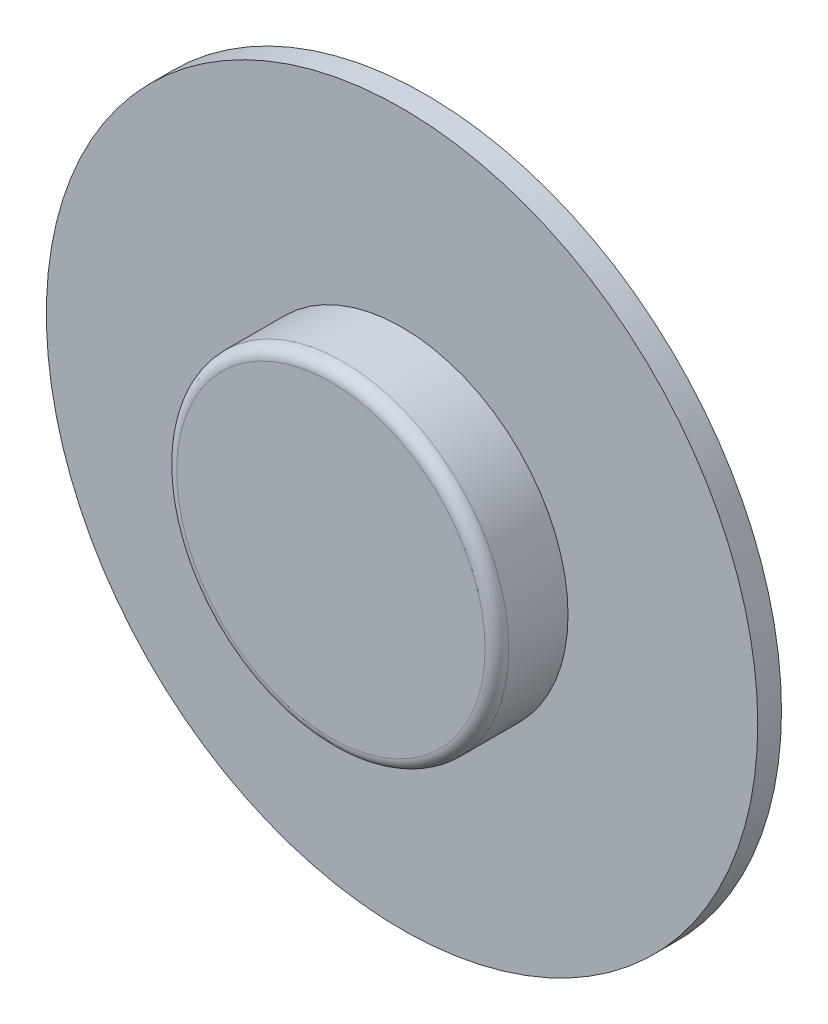
ISO-10303-21;
HEADER;
FILE_DESCRIPTION(('STEP AP214'),'2;1');
FILE_NAME('part.step','',(''),(''),'','','');
FILE_SCHEMA(('AUTOMOTIVE_DESIGN { 1 0 10303 214 1 1 1 1 }'));
ENDSEC;
DATA;
#1=APPLICATION_CONTEXT('core data for automotive mechanical design processes');
#2=APPLICATION_PROTOCOL_DEFINITION('international standard','automotive_design',2000,#1);
#3=PRODUCT_CONTEXT('',#1,'mechanical');
#4=PRODUCT('Part','Part','',(#3));
#5=PRODUCT_RELATED_PRODUCT_CATEGORY('part','',(#4));
#6=PRODUCT_DEFINITION_FORMATION('','',#4);
#7=PRODUCT_DEFINITION_CONTEXT('part definition',#1,'design');
#8=PRODUCT_DEFINITION('design','',#6,#7);
#9=PRODUCT_DEFINITION_SHAPE('','',#8);
#10=(LENGTH_UNIT() NAMED_UNIT(*) SI_UNIT(.MILLI.,.METRE.));
#11=(NAMED_UNIT(*) PLANE_ANGLE_UNIT() SI_UNIT($,.RADIAN.));
#12=(NAMED_UNIT(*) SI_UNIT($,.STERADIAN.) SOLID_ANGLE_UNIT());
#13=UNCERTAINTY_MEASURE_WITH_UNIT(LENGTH_MEASURE(1.E-05),#10,'distance_accuracy_value','');
#14=(GEOMETRIC_REPRESENTATION_CONTEXT(3) GLOBAL_UNCERTAINTY_ASSIGNED_CONTEXT((#13)) GLOBAL_UNIT_ASSIGNED_CONTEXT((#10,
#11,#12)) REPRESENTATION_CONTEXT('',''));
#15=CARTESIAN_POINT('',(0.,0.,0.));
#16=DIRECTION('',(0.,0.,1.));
#17=DIRECTION('',(1.,0.,0.));
#18=AXIS2_PLACEMENT_3D('',#15,#16,#17);
#19=CARTESIAN_POINT('',(0.,0.,1.));
#20=DIRECTION('',(0.,0.,-1.));
#21=DIRECTION('',(-1.,0.,0.));
#22=AXIS2_PLACEMENT_3D('',#19,#20,#21);
#23=CYLINDRICAL_SURFACE('',#22,15.);
#24=CARTESIAN_POINT('',(0.,0.,1.));
#25=DIRECTION('',(0.,0.,1.));
#26=DIRECTION('',(1.,0.,0.));
#27=AXIS2_PLACEMENT_3D('',#24,#25,#26);
#28=CIRCLE('',#27,15.);
#29=CARTESIAN_POINT('',(15.,0.,1.));
#30=VERTEX_POINT('',#29);
#31=EDGE_CURVE('E54',#30,#30,#28,.T.);
#32=ORIENTED_EDGE('',*,*,#31,.F.);
#33=EDGE_LOOP('',(#32));
#34=FACE_BOUND('',#33,.T.);
#35=CARTESIAN_POINT('',(0.,0.,0.));
#36=DIRECTION('',(0.,0.,1.));
#37=DIRECTION('',(1.,0.,0.));
#38=AXIS2_PLACEMENT_3D('',#35,#36,#37);
#39=CIRCLE('',#38,15.);
#40=CARTESIAN_POINT('',(15.,0.,0.));
#41=VERTEX_POINT('',#40);
#42=EDGE_CURVE('E57',#41,#41,#39,.T.);
#43=ORIENTED_EDGE('',*,*,#42,.T.);
#44=EDGE_LOOP('',(#43));
#45=FACE_BOUND('',#44,.T.);
#46=ADVANCED_FACE('F35',(#34,#45),#23,.T.);
#47=CARTESIAN_POINT('',(0.,0.,1.));
#48=DIRECTION('',(0.,0.,1.));
#49=DIRECTION('',(1.,0.,0.));
#50=AXIS2_PLACEMENT_3D('',#47,#48,#49);
#51=PLANE('',#50);
#52=CARTESIAN_POINT('',(0.,0.,1.));
#53=DIRECTION('',(0.,0.,1.));
#54=DIRECTION('',(1.,0.,0.));
#55=AXIS2_PLACEMENT_3D('',#52,#53,#54);
#56=CIRCLE('',#55,7.);
#57=CARTESIAN_POINT('',(7.,0.,1.));
#58=VERTEX_POINT('',#57);
#59=EDGE_CURVE('E51',#58,#58,#56,.T.);
#60=ORIENTED_EDGE('',*,*,#59,.F.);
#61=EDGE_LOOP('',(#60));
#62=FACE_BOUND('',#61,.T.);
#63=ORIENTED_EDGE('',*,*,#31,.T.);
#64=EDGE_LOOP('',(#63));
#65=FACE_BOUND('',#64,.T.);
#66=ADVANCED_FACE('F78',(#62,#65),#51,.T.);
#67=CARTESIAN_POINT('',(0.,0.,0.));
#68=DIRECTION('',(0.,0.,1.));
#69=DIRECTION('',(1.,0.,0.));
#70=AXIS2_PLACEMENT_3D('',#67,#68,#69);
#71=PLANE('',#70);
#72=CARTESIAN_POINT('',(0.,0.,0.));
#73=DIRECTION('',(0.,0.,-1.));
#74=DIRECTION('',(-1.,0.,0.));
#75=AXIS2_PLACEMENT_3D('',#72,#73,#74);
#76=CIRCLE('',#75,4.);
#77=CARTESIAN_POINT('',(-4.,0.,0.));
#78=VERTEX_POINT('',#77);
#79=EDGE_CURVE('E10',#78,#78,#76,.T.);
#80=ORIENTED_EDGE('',*,*,#79,.F.);
#81=EDGE_LOOP('',(#80));
#82=FACE_BOUND('',#81,.T.);
#83=ORIENTED_EDGE('',*,*,#42,.F.);
#84=EDGE_LOOP('',(#83));
#85=FACE_BOUND('',#84,.T.);
#86=ADVANCED_FACE('F83',(#82,#85),#71,.F.);
#87=CARTESIAN_POINT('',(0.,0.,4.));
#88=DIRECTION('',(0.,0.,-1.));
#89=DIRECTION('',(-1.,0.,0.));
#90=AXIS2_PLACEMENT_3D('',#87,#88,#89);
#91=CYLINDRICAL_SURFACE('',#90,7.);
#92=CARTESIAN_POINT('',(0.,0.,3.5));
#93=DIRECTION('',(0.,0.,1.));
#94=DIRECTION('',(1.,0.,0.));
#95=AXIS2_PLACEMENT_3D('',#92,#93,#94);
#96=CIRCLE('',#95,7.);
#97=CARTESIAN_POINT('',(7.,0.,3.5));
#98=VERTEX_POINT('',#97);
#99=EDGE_CURVE('E39',#98,#98,#96,.F.);
#100=ORIENTED_EDGE('',*,*,#99,.T.);
#101=EDGE_LOOP('',(#100));
#102=FACE_BOUND('',#101,.T.);
#103=ORIENTED_EDGE('',*,*,#59,.T.);
#104=EDGE_LOOP('',(#103));
#105=FACE_BOUND('',#104,.T.);
#106=ADVANCED_FACE('F74',(#102,#105),#91,.T.);
#107=CARTESIAN_POINT('',(0.,0.,4.));
#108=DIRECTION('',(0.,0.,1.));
#109=DIRECTION('',(1.,0.,0.));
#110=AXIS2_PLACEMENT_3D('',#107,#108,#109);
#111=PLANE('',#110);
#112=CARTESIAN_POINT('',(0.,0.,4.));
#113=DIRECTION('',(0.,0.,1.));
#114=DIRECTION('',(1.,0.,0.));
#115=AXIS2_PLACEMENT_3D('',#112,#113,#114);
#116=CIRCLE('',#115,6.5);
#117=CARTESIAN_POINT('',(6.5,0.,4.));
#118=VERTEX_POINT('',#117);
#119=EDGE_CURVE('E47',#118,#118,#116,.T.);
#120=ORIENTED_EDGE('',*,*,#119,.T.);
#121=EDGE_LOOP('',(#120));
#122=FACE_BOUND('',#121,.T.);
#123=ADVANCED_FACE('F62',(#122),#111,.T.);
#124=CARTESIAN_POINT('',(0.,0.,3.5));
#125=DIRECTION('',(0.,0.,1.));
#126=DIRECTION('',(1.,0.,0.));
#127=AXIS2_PLACEMENT_3D('',#124,#125,#126);
#128=TOROIDAL_SURFACE('',#127,6.5,0.5);
#129=ORIENTED_EDGE('',*,*,#99,.F.);
#130=EDGE_LOOP('',(#129));
#131=FACE_BOUND('',#130,.T.);
#132=ORIENTED_EDGE('',*,*,#119,.F.);
#133=EDGE_LOOP('',(#132));
#134=FACE_BOUND('',#133,.T.);
#135=ADVANCED_FACE('F37',(#131,#134),#128,.T.);
#136=CARTESIAN_POINT('',(0.,0.,-5.));
#137=DIRECTION('',(0.,0.,1.));
#138=DIRECTION('',(1.,0.,0.));
#139=AXIS2_PLACEMENT_3D('',#136,#137,#138);
#140=CYLINDRICAL_SURFACE('',#139,4.);
#141=CARTESIAN_POINT('',(0.,0.,-5.));
#142=DIRECTION('',(0.,0.,-1.));
#143=DIRECTION('',(-1.,0.,0.));
#144=AXIS2_PLACEMENT_3D('',#141,#142,#143);
#145=CIRCLE('',#144,4.);
#146=CARTESIAN_POINT('',(-4.,0.,-5.));
#147=VERTEX_POINT('',#146);
#148=EDGE_CURVE('E50',#147,#147,#145,.T.);
#149=ORIENTED_EDGE('',*,*,#148,.F.);
#150=EDGE_LOOP('',(#149));
#151=FACE_BOUND('',#150,.T.);
#152=ORIENTED_EDGE('',*,*,#79,.T.);
#153=EDGE_LOOP('',(#152));
#154=FACE_BOUND('',#153,.T.);
#155=ADVANCED_FACE('F65',(#151,#154),#140,.T.);
#156=CARTESIAN_POINT('',(0.,0.,-5.));
#157=DIRECTION('',(0.,0.,-1.));
#158=DIRECTION('',(-1.,0.,0.));
#159=AXIS2_PLACEMENT_3D('',#156,#157,#158);
#160=PLANE('',#159);
#161=ORIENTED_EDGE('',*,*,#148,.T.);
#162=EDGE_LOOP('',(#161));
#163=FACE_BOUND('',#162,.T.);
#164=ADVANCED_FACE('F71',(#163),#160,.T.);
#165=CLOSED_SHELL('',(#46,#66,#86,#106,#123,#135,#155,#164));
#166=MANIFOLD_SOLID_BREP('B2',#165);
#167=ADVANCED_BREP_SHAPE_REPRESENTATION('',(#18,#166),#14);
#168=SHAPE_DEFINITION_REPRESENTATION(#9,#167);
ENDSEC;
END-ISO-10303-21;
